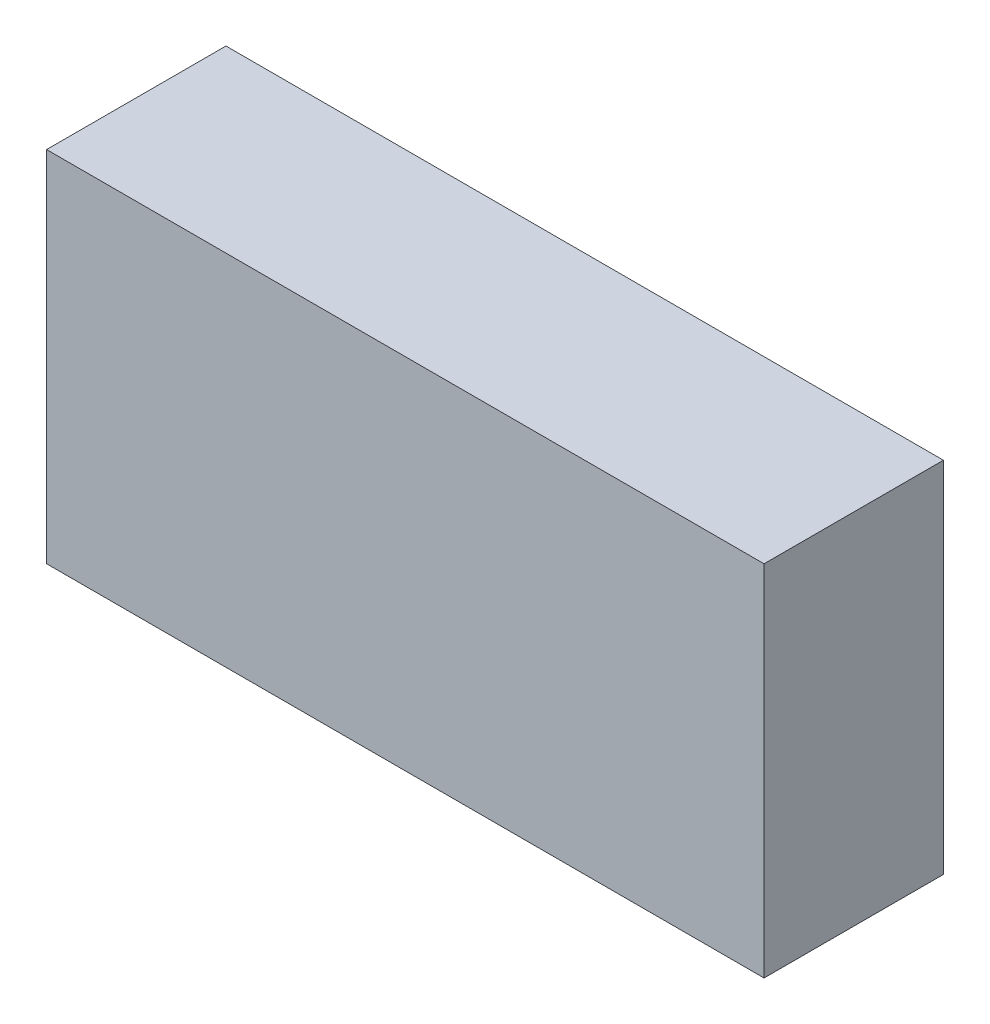
ISO-10303-21;
HEADER;
FILE_DESCRIPTION(('STEP AP214'),'2;1');
FILE_NAME('part.step','',(''),(''),'','','');
FILE_SCHEMA(('AUTOMOTIVE_DESIGN { 1 0 10303 214 1 1 1 1 }'));
ENDSEC;
DATA;
#1=APPLICATION_CONTEXT('core data for automotive mechanical design processes');
#2=APPLICATION_PROTOCOL_DEFINITION('international standard','automotive_design',2000,#1);
#3=PRODUCT_CONTEXT('',#1,'mechanical');
#4=PRODUCT('Part','Part','',(#3));
#5=PRODUCT_RELATED_PRODUCT_CATEGORY('part','',(#4));
#6=PRODUCT_DEFINITION_FORMATION('','',#4);
#7=PRODUCT_DEFINITION_CONTEXT('part definition',#1,'design');
#8=PRODUCT_DEFINITION('design','',#6,#7);
#9=PRODUCT_DEFINITION_SHAPE('','',#8);
#10=(LENGTH_UNIT() NAMED_UNIT(*) SI_UNIT(.MILLI.,.METRE.));
#11=(NAMED_UNIT(*) PLANE_ANGLE_UNIT() SI_UNIT($,.RADIAN.));
#12=(NAMED_UNIT(*) SI_UNIT($,.STERADIAN.) SOLID_ANGLE_UNIT());
#13=UNCERTAINTY_MEASURE_WITH_UNIT(LENGTH_MEASURE(1.E-05),#10,'distance_accuracy_value','');
#14=(GEOMETRIC_REPRESENTATION_CONTEXT(3) GLOBAL_UNCERTAINTY_ASSIGNED_CONTEXT((#13)) GLOBAL_UNIT_ASSIGNED_CONTEXT((#10,
#11,#12)) REPRESENTATION_CONTEXT('',''));
#15=CARTESIAN_POINT('',(0.,0.,0.));
#16=DIRECTION('',(0.,0.,1.));
#17=DIRECTION('',(1.,0.,0.));
#18=AXIS2_PLACEMENT_3D('',#15,#16,#17);
#19=CARTESIAN_POINT('',(0.,0.,-10.));
#20=DIRECTION('',(-1.,0.,0.));
#21=DIRECTION('',(0.,0.,1.));
#22=AXIS2_PLACEMENT_3D('',#19,#20,#21);
#23=PLANE('',#22);
#24=DIRECTION('',(0.,-1.,0.));
#25=VECTOR('',#24,1.);
#26=CARTESIAN_POINT('',(0.,0.,0.));
#27=LINE('',#26,#25);
#28=CARTESIAN_POINT('',(0.,20.,0.));
#29=VERTEX_POINT('',#28);
#30=CARTESIAN_POINT('',(0.,0.,0.));
#31=VERTEX_POINT('',#30);
#32=EDGE_CURVE('E107',#29,#31,#27,.T.);
#33=ORIENTED_EDGE('',*,*,#32,.F.);
#34=DIRECTION('',(0.,0.,1.));
#35=VECTOR('',#34,1.);
#36=CARTESIAN_POINT('',(0.,20.,-10.));
#37=LINE('',#36,#35);
#38=CARTESIAN_POINT('',(0.,20.,-10.));
#39=VERTEX_POINT('',#38);
#40=EDGE_CURVE('E11',#39,#29,#37,.T.);
#41=ORIENTED_EDGE('',*,*,#40,.F.);
#42=DIRECTION('',(0.,-1.,0.));
#43=VECTOR('',#42,1.);
#44=CARTESIAN_POINT('',(0.,0.,-10.));
#45=LINE('',#44,#43);
#46=CARTESIAN_POINT('',(0.,0.,-10.));
#47=VERTEX_POINT('',#46);
#48=EDGE_CURVE('E102',#39,#47,#45,.T.);
#49=ORIENTED_EDGE('',*,*,#48,.T.);
#50=DIRECTION('',(0.,0.,1.));
#51=VECTOR('',#50,1.);
#52=CARTESIAN_POINT('',(0.,0.,-10.));
#53=LINE('',#52,#51);
#54=EDGE_CURVE('E46',#47,#31,#53,.T.);
#55=ORIENTED_EDGE('',*,*,#54,.T.);
#56=EDGE_LOOP('',(#33,#41,#49,#55));
#57=FACE_BOUND('',#56,.T.);
#58=ADVANCED_FACE('F43',(#57),#23,.T.);
#59=CARTESIAN_POINT('',(0.,20.,-10.));
#60=DIRECTION('',(0.,1.,0.));
#61=DIRECTION('',(0.,0.,1.));
#62=AXIS2_PLACEMENT_3D('',#59,#60,#61);
#63=PLANE('',#62);
#64=DIRECTION('',(-1.,0.,0.));
#65=VECTOR('',#64,1.);
#66=CARTESIAN_POINT('',(0.,20.,0.));
#67=LINE('',#66,#65);
#68=CARTESIAN_POINT('',(40.,20.,0.));
#69=VERTEX_POINT('',#68);
#70=EDGE_CURVE('E104',#69,#29,#67,.T.);
#71=ORIENTED_EDGE('',*,*,#70,.F.);
#72=DIRECTION('',(0.,0.,1.));
#73=VECTOR('',#72,1.);
#74=CARTESIAN_POINT('',(40.,20.,-10.));
#75=LINE('',#74,#73);
#76=CARTESIAN_POINT('',(40.,20.,-10.));
#77=VERTEX_POINT('',#76);
#78=EDGE_CURVE('E55',#77,#69,#75,.T.);
#79=ORIENTED_EDGE('',*,*,#78,.F.);
#80=DIRECTION('',(-1.,0.,0.));
#81=VECTOR('',#80,1.);
#82=CARTESIAN_POINT('',(0.,20.,-10.));
#83=LINE('',#82,#81);
#84=EDGE_CURVE('E97',#77,#39,#83,.T.);
#85=ORIENTED_EDGE('',*,*,#84,.T.);
#86=ORIENTED_EDGE('',*,*,#40,.T.);
#87=EDGE_LOOP('',(#71,#79,#85,#86));
#88=FACE_BOUND('',#87,.T.);
#89=ADVANCED_FACE('F117',(#88),#63,.T.);
#90=CARTESIAN_POINT('',(40.,0.,-10.));
#91=DIRECTION('',(1.,0.,0.));
#92=DIRECTION('',(0.,0.,-1.));
#93=AXIS2_PLACEMENT_3D('',#90,#91,#92);
#94=PLANE('',#93);
#95=DIRECTION('',(0.,1.,0.));
#96=VECTOR('',#95,1.);
#97=CARTESIAN_POINT('',(40.,0.,0.));
#98=LINE('',#97,#96);
#99=CARTESIAN_POINT('',(40.,0.,0.));
#100=VERTEX_POINT('',#99);
#101=EDGE_CURVE('E93',#100,#69,#98,.T.);
#102=ORIENTED_EDGE('',*,*,#101,.F.);
#103=DIRECTION('',(0.,0.,1.));
#104=VECTOR('',#103,1.);
#105=CARTESIAN_POINT('',(40.,0.,-10.));
#106=LINE('',#105,#104);
#107=CARTESIAN_POINT('',(40.,0.,-10.));
#108=VERTEX_POINT('',#107);
#109=EDGE_CURVE('E88',#108,#100,#106,.T.);
#110=ORIENTED_EDGE('',*,*,#109,.F.);
#111=DIRECTION('',(0.,1.,0.));
#112=VECTOR('',#111,1.);
#113=CARTESIAN_POINT('',(40.,0.,-10.));
#114=LINE('',#113,#112);
#115=EDGE_CURVE('E91',#108,#77,#114,.T.);
#116=ORIENTED_EDGE('',*,*,#115,.T.);
#117=ORIENTED_EDGE('',*,*,#78,.T.);
#118=EDGE_LOOP('',(#102,#110,#116,#117));
#119=FACE_BOUND('',#118,.T.);
#120=ADVANCED_FACE('F89',(#119),#94,.T.);
#121=CARTESIAN_POINT('',(0.,0.,-10.));
#122=DIRECTION('',(0.,-1.,0.));
#123=DIRECTION('',(0.,0.,-1.));
#124=AXIS2_PLACEMENT_3D('',#121,#122,#123);
#125=PLANE('',#124);
#126=DIRECTION('',(1.,0.,0.));
#127=VECTOR('',#126,1.);
#128=CARTESIAN_POINT('',(0.,0.,0.));
#129=LINE('',#128,#127);
#130=EDGE_CURVE('E110',#31,#100,#129,.T.);
#131=ORIENTED_EDGE('',*,*,#130,.F.);
#132=ORIENTED_EDGE('',*,*,#54,.F.);
#133=DIRECTION('',(1.,0.,0.));
#134=VECTOR('',#133,1.);
#135=CARTESIAN_POINT('',(0.,0.,-10.));
#136=LINE('',#135,#134);
#137=EDGE_CURVE('E100',#47,#108,#136,.T.);
#138=ORIENTED_EDGE('',*,*,#137,.T.);
#139=ORIENTED_EDGE('',*,*,#109,.T.);
#140=EDGE_LOOP('',(#131,#132,#138,#139));
#141=FACE_BOUND('',#140,.T.);
#142=ADVANCED_FACE('F99',(#141),#125,.T.);
#143=CARTESIAN_POINT('',(0.,0.,-10.));
#144=DIRECTION('',(0.,0.,-1.));
#145=DIRECTION('',(-1.,0.,0.));
#146=AXIS2_PLACEMENT_3D('',#143,#144,#145);
#147=PLANE('',#146);
#148=ORIENTED_EDGE('',*,*,#48,.F.);
#149=ORIENTED_EDGE('',*,*,#84,.F.);
#150=ORIENTED_EDGE('',*,*,#115,.F.);
#151=ORIENTED_EDGE('',*,*,#137,.F.);
#152=EDGE_LOOP('',(#148,#149,#150,#151));
#153=FACE_BOUND('',#152,.T.);
#154=ADVANCED_FACE('F96',(#153),#147,.T.);
#155=CARTESIAN_POINT('',(0.,0.,0.));
#156=DIRECTION('',(0.,0.,-1.));
#157=DIRECTION('',(-1.,0.,0.));
#158=AXIS2_PLACEMENT_3D('',#155,#156,#157);
#159=PLANE('',#158);
#160=ORIENTED_EDGE('',*,*,#32,.T.);
#161=ORIENTED_EDGE('',*,*,#130,.T.);
#162=ORIENTED_EDGE('',*,*,#101,.T.);
#163=ORIENTED_EDGE('',*,*,#70,.T.);
#164=EDGE_LOOP('',(#160,#161,#162,#163));
#165=FACE_BOUND('',#164,.T.);
#166=ADVANCED_FACE('F116',(#165),#159,.F.);
#167=CLOSED_SHELL('',(#58,#89,#120,#142,#154,#166));
#168=MANIFOLD_SOLID_BREP('B2',#167);
#169=ADVANCED_BREP_SHAPE_REPRESENTATION('',(#18,#168),#14);
#170=SHAPE_DEFINITION_REPRESENTATION(#9,#169);
ENDSEC;
END-ISO-10303-21;
